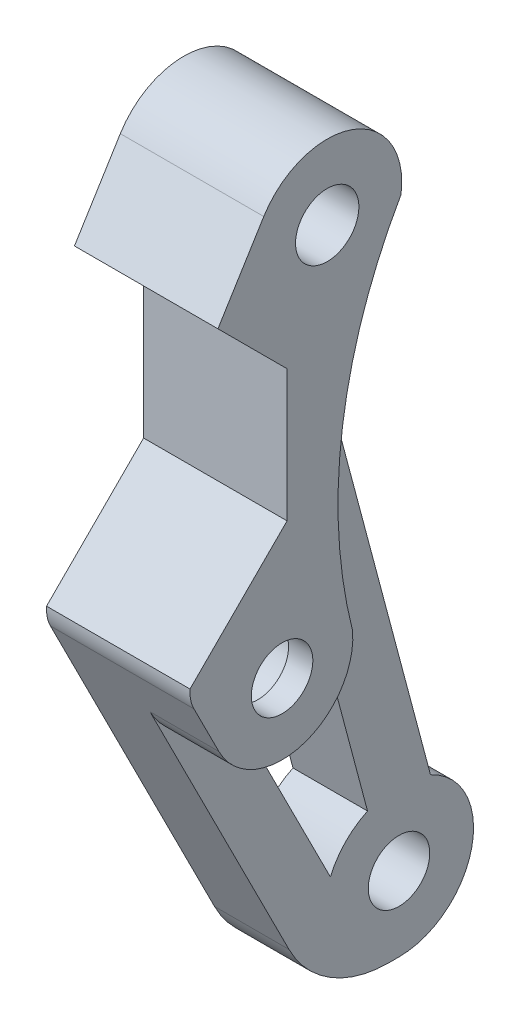
ISO-10303-21;
HEADER;
FILE_DESCRIPTION(('STEP AP214'),'2;1');
FILE_NAME('part.step','',(''),(''),'','','');
FILE_SCHEMA(('AUTOMOTIVE_DESIGN { 1 0 10303 214 1 1 1 1 }'));
ENDSEC;
DATA;
#1=APPLICATION_CONTEXT('core data for automotive mechanical design processes');
#2=APPLICATION_PROTOCOL_DEFINITION('international standard','automotive_design',2000,#1);
#3=PRODUCT_CONTEXT('',#1,'mechanical');
#4=PRODUCT('Part','Part','',(#3));
#5=PRODUCT_RELATED_PRODUCT_CATEGORY('part','',(#4));
#6=PRODUCT_DEFINITION_FORMATION('','',#4);
#7=PRODUCT_DEFINITION_CONTEXT('part definition',#1,'design');
#8=PRODUCT_DEFINITION('design','',#6,#7);
#9=PRODUCT_DEFINITION_SHAPE('','',#8);
#10=(LENGTH_UNIT() NAMED_UNIT(*) SI_UNIT(.MILLI.,.METRE.));
#11=(NAMED_UNIT(*) PLANE_ANGLE_UNIT() SI_UNIT($,.RADIAN.));
#12=(NAMED_UNIT(*) SI_UNIT($,.STERADIAN.) SOLID_ANGLE_UNIT());
#13=UNCERTAINTY_MEASURE_WITH_UNIT(LENGTH_MEASURE(1.E-05),#10,'distance_accuracy_value','');
#14=(GEOMETRIC_REPRESENTATION_CONTEXT(3) GLOBAL_UNCERTAINTY_ASSIGNED_CONTEXT((#13)) GLOBAL_UNIT_ASSIGNED_CONTEXT((#10,
#11,#12)) REPRESENTATION_CONTEXT('',''));
#15=CARTESIAN_POINT('',(0.,0.,0.));
#16=DIRECTION('',(0.,0.,1.));
#17=DIRECTION('',(1.,0.,0.));
#18=AXIS2_PLACEMENT_3D('',#15,#16,#17);
#19=CARTESIAN_POINT('',(7.7,0.,0.));
#20=DIRECTION('',(-1.,0.,0.));
#21=DIRECTION('',(0.,0.,1.));
#22=AXIS2_PLACEMENT_3D('',#19,#20,#21);
#23=PLANE('',#22);
#24=CARTESIAN_POINT('',(7.7,35.6438034109994,7.55308272610218));
#25=DIRECTION('',(-1.,0.,0.));
#26=DIRECTION('',(0.,0.,1.));
#27=AXIS2_PLACEMENT_3D('',#24,#25,#26);
#28=CIRCLE('',#27,1.7);
#29=CARTESIAN_POINT('',(7.7,35.6438034109994,9.25308272610218));
#30=VERTEX_POINT('',#29);
#31=EDGE_CURVE('E226',#30,#30,#28,.F.);
#32=ORIENTED_EDGE('',*,*,#31,.F.);
#33=EDGE_LOOP('',(#32));
#34=FACE_BOUND('',#33,.T.);
#35=CARTESIAN_POINT('',(7.7,15.7921957632189,9.97602858641019));
#36=DIRECTION('',(-1.,0.,0.));
#37=DIRECTION('',(0.,0.,1.));
#38=AXIS2_PLACEMENT_3D('',#35,#36,#37);
#39=CIRCLE('',#38,3.79758016363584);
#40=CARTESIAN_POINT('',(7.7,14.0804677214004,13.3659551652748));
#41=VERTEX_POINT('',#40);
#42=CARTESIAN_POINT('',(7.7,16.1061997343442,6.19145244034602));
#43=VERTEX_POINT('',#42);
#44=EDGE_CURVE('E231',#41,#43,#39,.F.);
#45=ORIENTED_EDGE('',*,*,#44,.T.);
#46=CARTESIAN_POINT('',(7.7,22.3796583886342,-18.5641875375977));
#47=DIRECTION('',(-1.,0.,0.));
#48=DIRECTION('',(0.,0.,1.));
#49=AXIS2_PLACEMENT_3D('',#46,#47,#48);
#50=CIRCLE('',#49,25.5381674010617);
#51=CARTESIAN_POINT('',(7.7,35.0777791166732,3.59333317616438));
#52=VERTEX_POINT('',#51);
#53=EDGE_CURVE('E223',#52,#43,#50,.F.);
#54=ORIENTED_EDGE('',*,*,#53,.F.);
#55=CARTESIAN_POINT('',(7.7,35.6438034109994,7.55308272610218));
#56=DIRECTION('',(-1.,0.,0.));
#57=DIRECTION('',(0.,0.,1.));
#58=AXIS2_PLACEMENT_3D('',#55,#56,#57);
#59=CIRCLE('',#58,4.00000000000001);
#60=CARTESIAN_POINT('',(7.7,37.7439659027633,10.9573913942737));
#61=VERTEX_POINT('',#60);
#62=EDGE_CURVE('E229',#61,#52,#59,.T.);
#63=ORIENTED_EDGE('',*,*,#62,.F.);
#64=DIRECTION('',(0.,0.851077167042886,-0.525040622940982));
#65=VECTOR('',#64,1.);
#66=CARTESIAN_POINT('',(7.7,15.3011018850537,24.8026874035418));
#67=LINE('',#66,#65);
#68=CARTESIAN_POINT('',(7.7,33.7544105775254,13.4186001945268));
#69=VERTEX_POINT('',#68);
#70=EDGE_CURVE('E224',#69,#61,#67,.T.);
#71=ORIENTED_EDGE('',*,*,#70,.F.);
#72=DIRECTION('',(0.,0.707106781186548,0.707106781186548));
#73=VECTOR('',#72,1.);
#74=CARTESIAN_POINT('',(7.7,10.1679051914993,-10.1679051914993));
#75=LINE('',#74,#73);
#76=CARTESIAN_POINT('',(7.7,30.0429893561653,9.70717897316674));
#77=VERTEX_POINT('',#76);
#78=EDGE_CURVE('E197',#77,#69,#75,.T.);
#79=ORIENTED_EDGE('',*,*,#78,.F.);
#80=DIRECTION('',(0.,1.,0.));
#81=VECTOR('',#80,1.);
#82=CARTESIAN_POINT('',(7.7,0.,9.70717897316675));
#83=LINE('',#82,#81);
#84=CARTESIAN_POINT('',(7.7,22.9719215442998,9.70717897316674));
#85=VERTEX_POINT('',#84);
#86=EDGE_CURVE('E367',#85,#77,#83,.T.);
#87=ORIENTED_EDGE('',*,*,#86,.F.);
#88=DIRECTION('',(0.,-0.707106781186548,0.707106781186547));
#89=VECTOR('',#88,1.);
#90=CARTESIAN_POINT('',(7.7,16.3395502587333,16.3395502587333));
#91=LINE('',#90,#89);
#92=CARTESIAN_POINT('',(7.7,17.76189961562,14.9172009018465));
#93=VERTEX_POINT('',#92);
#94=EDGE_CURVE('E11',#85,#93,#91,.T.);
#95=ORIENTED_EDGE('',*,*,#94,.T.);
#96=CARTESIAN_POINT('',(7.7,17.6366537905337,12.9211263833732));
#97=DIRECTION('',(-1.,0.,0.));
#98=DIRECTION('',(0.,0.,1.));
#99=AXIS2_PLACEMENT_3D('',#96,#97,#98);
#100=CIRCLE('',#99,2.);
#101=CARTESIAN_POINT('',(7.7,16.7351702309716,14.7064351499005));
#102=VERTEX_POINT('',#101);
#103=EDGE_CURVE('E49',#93,#102,#100,.F.);
#104=ORIENTED_EDGE('',*,*,#103,.T.);
#105=DIRECTION('',(0.,0.892654383263649,0.450741779781057));
#106=VECTOR('',#105,1.);
#107=CARTESIAN_POINT('',(7.7,-2.5171780092854,4.98504927707151));
#108=LINE('',#107,#106);
#109=EDGE_CURVE('E227',#41,#102,#108,.T.);
#110=ORIENTED_EDGE('',*,*,#109,.F.);
#111=EDGE_LOOP('',(#45,#54,#63,#71,#79,#87,#95,#104,#110));
#112=FACE_BOUND('',#111,.T.);
#113=CARTESIAN_POINT('',(7.7,15.7921957632189,9.97602858641019));
#114=DIRECTION('',(-1.,0.,0.));
#115=DIRECTION('',(0.,0.,1.));
#116=AXIS2_PLACEMENT_3D('',#113,#114,#115);
#117=CIRCLE('',#116,1.65);
#118=CARTESIAN_POINT('',(7.7,15.7921957632189,11.6260285864102));
#119=VERTEX_POINT('',#118);
#120=EDGE_CURVE('E44',#119,#119,#117,.F.);
#121=ORIENTED_EDGE('',*,*,#120,.F.);
#122=EDGE_LOOP('',(#121));
#123=FACE_BOUND('',#122,.T.);
#124=ADVANCED_FACE('F41',(#34,#112,#123),#23,.F.);
#125=CARTESIAN_POINT('',(26.4844851065071,-4.,0.));
#126=DIRECTION('',(0.,-1.,0.));
#127=DIRECTION('',(0.,0.,-1.));
#128=AXIS2_PLACEMENT_3D('',#125,#126,#127);
#129=PLANE('',#128);
#130=DIRECTION('',(0.,0.,1.));
#131=VECTOR('',#130,1.);
#132=CARTESIAN_POINT('',(4.,-4.,0.));
#133=LINE('',#132,#131);
#134=CARTESIAN_POINT('',(4.,-4.,0.));
#135=VERTEX_POINT('',#134);
#136=CARTESIAN_POINT('',(4.,-4.,0.544451416548721));
#137=VERTEX_POINT('',#136);
#138=EDGE_CURVE('E410',#135,#137,#133,.T.);
#139=ORIENTED_EDGE('',*,*,#138,.T.);
#140=DIRECTION('',(-1.,0.,0.));
#141=VECTOR('',#140,1.);
#142=CARTESIAN_POINT('',(0.,-4.,0.544451416548721));
#143=LINE('',#142,#141);
#144=CARTESIAN_POINT('',(0.,-4.,0.544451416548721));
#145=VERTEX_POINT('',#144);
#146=EDGE_CURVE('E271',#137,#145,#143,.T.);
#147=ORIENTED_EDGE('',*,*,#146,.T.);
#148=DIRECTION('',(0.,0.,1.));
#149=VECTOR('',#148,1.);
#150=CARTESIAN_POINT('',(0.,-4.,0.));
#151=LINE('',#150,#149);
#152=CARTESIAN_POINT('',(0.,-4.,0.));
#153=VERTEX_POINT('',#152);
#154=EDGE_CURVE('E401',#153,#145,#151,.T.);
#155=ORIENTED_EDGE('',*,*,#154,.F.);
#156=DIRECTION('',(-1.,0.,0.));
#157=VECTOR('',#156,1.);
#158=CARTESIAN_POINT('',(26.4844851065071,-4.,0.));
#159=LINE('',#158,#157);
#160=EDGE_CURVE('E413',#135,#153,#159,.T.);
#161=ORIENTED_EDGE('',*,*,#160,.F.);
#162=EDGE_LOOP('',(#139,#147,#155,#161));
#163=FACE_BOUND('',#162,.T.);
#164=ADVANCED_FACE('F242',(#163),#129,.T.);
#165=CARTESIAN_POINT('',(4.,0.,0.));
#166=DIRECTION('',(-1.,0.,0.));
#167=DIRECTION('',(0.,0.,1.));
#168=AXIS2_PLACEMENT_3D('',#165,#166,#167);
#169=CYLINDRICAL_SURFACE('',#168,4.);
#170=CARTESIAN_POINT('',(4.,0.,0.));
#171=DIRECTION('',(1.,0.,0.));
#172=DIRECTION('',(0.,0.,-1.));
#173=AXIS2_PLACEMENT_3D('',#170,#171,#172);
#174=CIRCLE('',#173,4.);
#175=CARTESIAN_POINT('',(4.,3.62606237375002,-1.68868933249261));
#176=VERTEX_POINT('',#175);
#177=EDGE_CURVE('E315',#135,#176,#174,.T.);
#178=ORIENTED_EDGE('',*,*,#177,.F.);
#179=ORIENTED_EDGE('',*,*,#160,.T.);
#180=CARTESIAN_POINT('',(0.,0.,0.));
#181=DIRECTION('',(1.,0.,0.));
#182=DIRECTION('',(0.,0.,-1.));
#183=AXIS2_PLACEMENT_3D('',#180,#181,#182);
#184=CIRCLE('',#183,4.);
#185=CARTESIAN_POINT('',(0.,3.62606237375002,-1.68868933249261));
#186=VERTEX_POINT('',#185);
#187=EDGE_CURVE('E308',#153,#186,#184,.T.);
#188=ORIENTED_EDGE('',*,*,#187,.T.);
#189=DIRECTION('',(1.,0.,0.));
#190=VECTOR('',#189,1.);
#191=CARTESIAN_POINT('',(-30.4230571040035,3.62606237375002,-1.68868933249261));
#192=LINE('',#191,#190);
#193=EDGE_CURVE('E299',#186,#176,#192,.T.);
#194=ORIENTED_EDGE('',*,*,#193,.T.);
#195=EDGE_LOOP('',(#178,#179,#188,#194));
#196=FACE_BOUND('',#195,.T.);
#197=ADVANCED_FACE('F454',(#196),#169,.T.);
#198=CARTESIAN_POINT('',(0.,3.62606237375002,1.68868933249261));
#199=VERTEX_POINT('',#198);
#200=CARTESIAN_POINT('',(0.,1.56023781306374,3.6831586942034));
#201=VERTEX_POINT('',#200);
#202=EDGE_CURVE('E316',#199,#201,#184,.T.);
#203=ORIENTED_EDGE('',*,*,#202,.T.);
#204=DIRECTION('',(-1.,0.,0.));
#205=VECTOR('',#204,1.);
#206=CARTESIAN_POINT('',(26.4844851065071,1.56023781306374,3.6831586942034));
#207=LINE('',#206,#205);
#208=CARTESIAN_POINT('',(4.,1.56023781306374,3.6831586942034));
#209=VERTEX_POINT('',#208);
#210=EDGE_CURVE('E406',#209,#201,#207,.T.);
#211=ORIENTED_EDGE('',*,*,#210,.F.);
#212=CARTESIAN_POINT('',(4.,3.62606237375002,1.68868933249261));
#213=VERTEX_POINT('',#212);
#214=EDGE_CURVE('E311',#213,#209,#174,.T.);
#215=ORIENTED_EDGE('',*,*,#214,.F.);
#216=DIRECTION('',(1.,0.,0.));
#217=VECTOR('',#216,1.);
#218=CARTESIAN_POINT('',(-30.4230571040035,3.62606237375002,1.68868933249261));
#219=LINE('',#218,#217);
#220=EDGE_CURVE('E298',#199,#213,#219,.T.);
#221=ORIENTED_EDGE('',*,*,#220,.F.);
#222=EDGE_LOOP('',(#203,#211,#215,#221));
#223=FACE_BOUND('',#222,.T.);
#224=ADVANCED_FACE('F422',(#223),#169,.T.);
#225=CARTESIAN_POINT('',(26.4844851065071,12.118374083072,9.01444168876506));
#226=DIRECTION('',(0.,0.450741779781056,-0.892654383263649));
#227=DIRECTION('',(0.,0.892654383263649,0.450741779781056));
#228=AXIS2_PLACEMENT_3D('',#225,#226,#227);
#229=PLANE('',#228);
#230=DIRECTION('',(0.,-0.892654383263649,-0.450741779781056));
#231=VECTOR('',#230,1.);
#232=CARTESIAN_POINT('',(0.,12.118374083072,9.01444168876506));
#233=LINE('',#232,#231);
#234=CARTESIAN_POINT('',(0.,11.6056471528656,8.75554255221689));
#235=VERTEX_POINT('',#234);
#236=EDGE_CURVE('E400',#235,#201,#233,.T.);
#237=ORIENTED_EDGE('',*,*,#236,.F.);
#238=DIRECTION('',(-1.,0.,0.));
#239=VECTOR('',#238,1.);
#240=CARTESIAN_POINT('',(4.,11.6056471528656,8.75554255221689));
#241=LINE('',#240,#239);
#242=CARTESIAN_POINT('',(4.,11.6056471528656,8.75554255221689));
#243=VERTEX_POINT('',#242);
#244=EDGE_CURVE('E321',#235,#243,#241,.F.);
#245=ORIENTED_EDGE('',*,*,#244,.T.);
#246=DIRECTION('',(0.,-0.892654383263649,-0.450741779781056));
#247=VECTOR('',#246,1.);
#248=CARTESIAN_POINT('',(4.,12.118374083072,9.01444168876506));
#249=LINE('',#248,#247);
#250=EDGE_CURVE('E332',#243,#209,#249,.T.);
#251=ORIENTED_EDGE('',*,*,#250,.T.);
#252=ORIENTED_EDGE('',*,*,#210,.T.);
#253=EDGE_LOOP('',(#237,#245,#251,#252));
#254=FACE_BOUND('',#253,.T.);
#255=ADVANCED_FACE('F419',(#254),#229,.T.);
#256=CARTESIAN_POINT('',(-15.4235639409025,18.1405352375146,6.06738803288033));
#257=DIRECTION('',(1.,0.,0.));
#258=DIRECTION('',(0.,0.,-1.));
#259=AXIS2_PLACEMENT_3D('',#256,#257,#258);
#260=CYLINDRICAL_SURFACE('',#259,0.5);
#261=CARTESIAN_POINT('',(4.,18.1405352375146,6.06738803288033));
#262=DIRECTION('',(1.,0.,0.));
#263=DIRECTION('',(0.,0.,-1.));
#264=AXIS2_PLACEMENT_3D('',#261,#262,#263);
#265=CIRCLE('',#264,0.5);
#266=CARTESIAN_POINT('',(4.,18.0554917511465,6.56010256019443));
#267=VERTEX_POINT('',#266);
#268=CARTESIAN_POINT('',(4.,18.2690800368411,5.58419424715238));
#269=VERTEX_POINT('',#268);
#270=EDGE_CURVE('E189',#267,#269,#265,.F.);
#271=ORIENTED_EDGE('',*,*,#270,.F.);
#272=DIRECTION('',(1.,0.,0.));
#273=VECTOR('',#272,1.);
#274=CARTESIAN_POINT('',(-15.4235639409025,18.0554917511465,6.56010256019444));
#275=LINE('',#274,#273);
#276=CARTESIAN_POINT('',(0.,18.0554917511465,6.56010256019443));
#277=VERTEX_POINT('',#276);
#278=EDGE_CURVE('E201',#277,#267,#275,.T.);
#279=ORIENTED_EDGE('',*,*,#278,.F.);
#280=CARTESIAN_POINT('',(0.,18.1405352375146,6.06738803288033));
#281=DIRECTION('',(1.,0.,0.));
#282=DIRECTION('',(0.,0.,-1.));
#283=AXIS2_PLACEMENT_3D('',#280,#281,#282);
#284=CIRCLE('',#283,0.5);
#285=CARTESIAN_POINT('',(0.,18.2690800368411,5.58419424715238));
#286=VERTEX_POINT('',#285);
#287=EDGE_CURVE('E211',#286,#277,#284,.T.);
#288=ORIENTED_EDGE('',*,*,#287,.F.);
#289=DIRECTION('',(-1.,0.,0.));
#290=VECTOR('',#289,1.);
#291=CARTESIAN_POINT('',(0.,18.2690800368411,5.58419424715238));
#292=LINE('',#291,#290);
#293=EDGE_CURVE('E206',#269,#286,#292,.T.);
#294=ORIENTED_EDGE('',*,*,#293,.F.);
#295=EDGE_LOOP('',(#271,#279,#288,#294));
#296=FACE_BOUND('',#295,.T.);
#297=ADVANCED_FACE('F208',(#296),#260,.F.);
#298=CARTESIAN_POINT('',(-30.4230571040035,-0.179886996558466,0.676186662748976));
#299=DIRECTION('',(0.,0.257089598652981,-0.966387571455909));
#300=DIRECTION('',(0.,0.966387571455909,0.257089598652981));
#301=AXIS2_PLACEMENT_3D('',#298,#299,#300);
#302=PLANE('',#301);
#303=DIRECTION('',(0.,0.966387571455909,0.257089598652981));
#304=VECTOR('',#303,1.);
#305=CARTESIAN_POINT('',(4.,-0.179886996558466,0.676186662748976));
#306=LINE('',#305,#304);
#307=EDGE_CURVE('E287',#213,#269,#306,.T.);
#308=ORIENTED_EDGE('',*,*,#307,.T.);
#309=ORIENTED_EDGE('',*,*,#293,.T.);
#310=DIRECTION('',(0.,-0.966387571455909,-0.257089598652981));
#311=VECTOR('',#310,1.);
#312=CARTESIAN_POINT('',(0.,-0.179886996558466,0.676186662748976));
#313=LINE('',#312,#311);
#314=EDGE_CURVE('E293',#286,#199,#313,.T.);
#315=ORIENTED_EDGE('',*,*,#314,.T.);
#316=ORIENTED_EDGE('',*,*,#220,.T.);
#317=EDGE_LOOP('',(#308,#309,#315,#316));
#318=FACE_BOUND('',#317,.T.);
#319=ADVANCED_FACE('F426',(#318),#302,.F.);
#320=CARTESIAN_POINT('',(4.,35.6438034109994,7.55308272610218));
#321=DIRECTION('',(-1.,0.,0.));
#322=DIRECTION('',(0.,0.,1.));
#323=AXIS2_PLACEMENT_3D('',#320,#321,#322);
#324=CYLINDRICAL_SURFACE('',#323,1.65);
#325=CARTESIAN_POINT('',(4.,35.6438034109994,7.55308272610218));
#326=DIRECTION('',(1.,0.,0.));
#327=DIRECTION('',(0.,0.,-1.));
#328=AXIS2_PLACEMENT_3D('',#325,#326,#327);
#329=CIRCLE('',#328,1.65);
#330=CARTESIAN_POINT('',(4.,35.6438034109994,5.90308272610218));
#331=VERTEX_POINT('',#330);
#332=EDGE_CURVE('E283',#331,#331,#329,.T.);
#333=ORIENTED_EDGE('',*,*,#332,.T.);
#334=EDGE_LOOP('',(#333));
#335=FACE_BOUND('',#334,.T.);
#336=CARTESIAN_POINT('',(0.,35.6438034109994,7.55308272610218));
#337=DIRECTION('',(1.,0.,0.));
#338=DIRECTION('',(0.,0.,-1.));
#339=AXIS2_PLACEMENT_3D('',#336,#337,#338);
#340=CIRCLE('',#339,1.65);
#341=CARTESIAN_POINT('',(0.,35.6438034109994,5.90308272610218));
#342=VERTEX_POINT('',#341);
#343=EDGE_CURVE('E284',#342,#342,#340,.T.);
#344=ORIENTED_EDGE('',*,*,#343,.F.);
#345=EDGE_LOOP('',(#344));
#346=FACE_BOUND('',#345,.T.);
#347=ADVANCED_FACE('F428',(#335,#346),#324,.F.);
#348=CARTESIAN_POINT('',(4.,0.,0.));
#349=DIRECTION('',(-1.,0.,0.));
#350=DIRECTION('',(0.,0.,1.));
#351=AXIS2_PLACEMENT_3D('',#348,#349,#350);
#352=CYLINDRICAL_SURFACE('',#351,1.65);
#353=CARTESIAN_POINT('',(4.,0.,0.));
#354=DIRECTION('',(1.,0.,0.));
#355=DIRECTION('',(0.,0.,-1.));
#356=AXIS2_PLACEMENT_3D('',#353,#354,#355);
#357=CIRCLE('',#356,1.65);
#358=CARTESIAN_POINT('',(4.,0.,-1.65));
#359=VERTEX_POINT('',#358);
#360=EDGE_CURVE('E305',#359,#359,#357,.T.);
#361=ORIENTED_EDGE('',*,*,#360,.T.);
#362=EDGE_LOOP('',(#361));
#363=FACE_BOUND('',#362,.T.);
#364=CARTESIAN_POINT('',(0.,0.,0.));
#365=DIRECTION('',(1.,0.,0.));
#366=DIRECTION('',(0.,0.,-1.));
#367=AXIS2_PLACEMENT_3D('',#364,#365,#366);
#368=CIRCLE('',#367,1.65);
#369=CARTESIAN_POINT('',(0.,0.,-1.65));
#370=VERTEX_POINT('',#369);
#371=EDGE_CURVE('E292',#370,#370,#368,.T.);
#372=ORIENTED_EDGE('',*,*,#371,.F.);
#373=EDGE_LOOP('',(#372));
#374=FACE_BOUND('',#373,.T.);
#375=ADVANCED_FACE('F434',(#363,#374),#352,.F.);
#376=CARTESIAN_POINT('',(6.4,15.7921957632189,9.97602858641019));
#377=DIRECTION('',(-1.,0.,0.));
#378=DIRECTION('',(0.,0.,1.));
#379=AXIS2_PLACEMENT_3D('',#376,#377,#378);
#380=CYLINDRICAL_SURFACE('',#379,2.25);
#381=CARTESIAN_POINT('',(6.4,15.7921957632189,9.97602858641019));
#382=DIRECTION('',(-1.,0.,0.));
#383=DIRECTION('',(0.,0.,1.));
#384=AXIS2_PLACEMENT_3D('',#381,#382,#383);
#385=CIRCLE('',#384,2.25);
#386=CARTESIAN_POINT('',(6.4,15.7921957632189,12.2260285864102));
#387=VERTEX_POINT('',#386);
#388=EDGE_CURVE('E260',#387,#387,#385,.T.);
#389=ORIENTED_EDGE('',*,*,#388,.F.);
#390=EDGE_LOOP('',(#389));
#391=FACE_BOUND('',#390,.T.);
#392=CARTESIAN_POINT('',(0.,15.7921957632189,9.97602858641019));
#393=DIRECTION('',(-1.,0.,0.));
#394=DIRECTION('',(0.,0.,1.));
#395=AXIS2_PLACEMENT_3D('',#392,#393,#394);
#396=CIRCLE('',#395,2.25);
#397=CARTESIAN_POINT('',(0.,15.7921957632189,12.2260285864102));
#398=VERTEX_POINT('',#397);
#399=EDGE_CURVE('E266',#398,#398,#396,.T.);
#400=ORIENTED_EDGE('',*,*,#399,.T.);
#401=EDGE_LOOP('',(#400));
#402=FACE_BOUND('',#401,.T.);
#403=ADVANCED_FACE('F443',(#391,#402),#380,.F.);
#404=CARTESIAN_POINT('',(26.4844851065071,2.,0.544451416548721));
#405=DIRECTION('',(1.,0.,0.));
#406=DIRECTION('',(0.,0.,-1.));
#407=AXIS2_PLACEMENT_3D('',#404,#405,#406);
#408=CYLINDRICAL_SURFACE('',#407,6.);
#409=CARTESIAN_POINT('',(4.,2.,0.544451416548721));
#410=DIRECTION('',(1.,0.,0.));
#411=DIRECTION('',(0.,0.,-1.));
#412=AXIS2_PLACEMENT_3D('',#409,#410,#411);
#413=CIRCLE('',#412,6.);
#414=CARTESIAN_POINT('',(4.,-0.704450678686354,5.90037771613063));
#415=VERTEX_POINT('',#414);
#416=EDGE_CURVE('E279',#415,#137,#413,.T.);
#417=ORIENTED_EDGE('',*,*,#416,.F.);
#418=DIRECTION('',(-1.,0.,0.));
#419=VECTOR('',#418,1.);
#420=CARTESIAN_POINT('',(4.,-0.704450678686342,5.90037771613061));
#421=LINE('',#420,#419);
#422=CARTESIAN_POINT('',(0.,-0.704450678686342,5.90037771613061));
#423=VERTEX_POINT('',#422);
#424=EDGE_CURVE('E277',#423,#415,#421,.F.);
#425=ORIENTED_EDGE('',*,*,#424,.F.);
#426=CARTESIAN_POINT('',(0.,2.,0.544451416548721));
#427=DIRECTION('',(1.,0.,0.));
#428=DIRECTION('',(0.,0.,-1.));
#429=AXIS2_PLACEMENT_3D('',#426,#427,#428);
#430=CIRCLE('',#429,6.);
#431=EDGE_CURVE('E274',#145,#423,#430,.F.);
#432=ORIENTED_EDGE('',*,*,#431,.F.);
#433=ORIENTED_EDGE('',*,*,#146,.F.);
#434=EDGE_LOOP('',(#417,#425,#432,#433));
#435=FACE_BOUND('',#434,.T.);
#436=ADVANCED_FACE('F469',(#435),#408,.T.);
#437=CARTESIAN_POINT('',(-15.4235639409025,22.3919133800727,-18.5637255467815));
#438=DIRECTION('',(1.,0.,0.));
#439=DIRECTION('',(0.,0.,-1.));
#440=AXIS2_PLACEMENT_3D('',#437,#438,#439);
#441=CYLINDRICAL_SURFACE('',#440,25.4953190074706);
#442=CARTESIAN_POINT('',(4.,22.3919133800727,-18.5637255467815));
#443=DIRECTION('',(1.,0.,0.));
#444=DIRECTION('',(0.,0.,-1.));
#445=AXIS2_PLACEMENT_3D('',#442,#443,#444);
#446=CIRCLE('',#445,25.4953190074706);
#447=CARTESIAN_POINT('',(4.,16.6511192090167,6.2768576504437));
#448=VERTEX_POINT('',#447);
#449=EDGE_CURVE('E184',#448,#267,#446,.F.);
#450=ORIENTED_EDGE('',*,*,#449,.F.);
#451=DIRECTION('',(1.,0.,0.));
#452=VECTOR('',#451,1.);
#453=CARTESIAN_POINT('',(-15.4235639409025,16.6511192090167,6.27685765044361));
#454=LINE('',#453,#452);
#455=CARTESIAN_POINT('',(0.,16.6511192090167,6.27685765044361));
#456=VERTEX_POINT('',#455);
#457=EDGE_CURVE('E347',#456,#448,#454,.T.);
#458=ORIENTED_EDGE('',*,*,#457,.F.);
#459=CARTESIAN_POINT('',(0.,22.3919133800727,-18.5637255467815));
#460=DIRECTION('',(1.,0.,0.));
#461=DIRECTION('',(0.,0.,-1.));
#462=AXIS2_PLACEMENT_3D('',#459,#460,#461);
#463=CIRCLE('',#462,25.4953190074706);
#464=EDGE_CURVE('E203',#456,#277,#463,.F.);
#465=ORIENTED_EDGE('',*,*,#464,.T.);
#466=ORIENTED_EDGE('',*,*,#278,.T.);
#467=EDGE_LOOP('',(#450,#458,#465,#466));
#468=FACE_BOUND('',#467,.T.);
#469=ADVANCED_FACE('F202',(#468),#441,.F.);
#470=CARTESIAN_POINT('',(-15.4235639409025,11.8310180427561,8.30921536058507));
#471=DIRECTION('',(1.,0.,0.));
#472=DIRECTION('',(0.,0.,-1.));
#473=AXIS2_PLACEMENT_3D('',#470,#471,#472);
#474=CYLINDRICAL_SURFACE('',#473,0.5);
#475=CARTESIAN_POINT('',(4.,11.8310180427561,8.30921536058507));
#476=DIRECTION('',(1.,0.,0.));
#477=DIRECTION('',(0.,0.,-1.));
#478=AXIS2_PLACEMENT_3D('',#475,#476,#477);
#479=CIRCLE('',#478,0.5);
#480=CARTESIAN_POINT('',(4.,12.2918794542523,8.50313998355417));
#481=VERTEX_POINT('',#480);
#482=EDGE_CURVE('E216',#243,#481,#479,.F.);
#483=ORIENTED_EDGE('',*,*,#482,.F.);
#484=ORIENTED_EDGE('',*,*,#244,.F.);
#485=CARTESIAN_POINT('',(0.,11.8310180427561,8.30921536058507));
#486=DIRECTION('',(1.,0.,0.));
#487=DIRECTION('',(0.,0.,-1.));
#488=AXIS2_PLACEMENT_3D('',#485,#486,#487);
#489=CIRCLE('',#488,0.5);
#490=CARTESIAN_POINT('',(0.,12.2918794542523,8.50313998355417));
#491=VERTEX_POINT('',#490);
#492=EDGE_CURVE('E205',#491,#235,#489,.T.);
#493=ORIENTED_EDGE('',*,*,#492,.F.);
#494=DIRECTION('',(1.,0.,0.));
#495=VECTOR('',#494,1.);
#496=CARTESIAN_POINT('',(-15.4235639409025,12.2918794542523,8.50313998355417));
#497=LINE('',#496,#495);
#498=EDGE_CURVE('E314',#481,#491,#497,.F.);
#499=ORIENTED_EDGE('',*,*,#498,.F.);
#500=EDGE_LOOP('',(#483,#484,#493,#499));
#501=FACE_BOUND('',#500,.T.);
#502=ADVANCED_FACE('F335',(#501),#474,.F.);
#503=CARTESIAN_POINT('',(-15.4235639409025,-2.5171780092854,4.98504927707151));
#504=DIRECTION('',(0.,0.450741779781057,-0.892654383263649));
#505=DIRECTION('',(0.,0.892654383263649,0.450741779781057));
#506=AXIS2_PLACEMENT_3D('',#503,#504,#505);
#507=PLANE('',#506);
#508=DIRECTION('',(1.,0.,0.));
#509=VECTOR('',#508,1.);
#510=CARTESIAN_POINT('',(-15.4235639409025,14.0804677214004,13.3659551652748));
#511=LINE('',#510,#509);
#512=CARTESIAN_POINT('',(4.,14.0804677214004,13.3659551652748));
#513=VERTEX_POINT('',#512);
#514=EDGE_CURVE('E263',#513,#41,#511,.T.);
#515=ORIENTED_EDGE('',*,*,#514,.T.);
#516=ORIENTED_EDGE('',*,*,#109,.T.);
#517=DIRECTION('',(1.,0.,0.));
#518=VECTOR('',#517,1.);
#519=CARTESIAN_POINT('',(0.,16.7351702309716,14.7064351499005));
#520=LINE('',#519,#518);
#521=CARTESIAN_POINT('',(0.,16.7351702309716,14.7064351499005));
#522=VERTEX_POINT('',#521);
#523=EDGE_CURVE('E346',#102,#522,#520,.F.);
#524=ORIENTED_EDGE('',*,*,#523,.T.);
#525=DIRECTION('',(0.,-0.892654383263649,-0.450741779781057));
#526=VECTOR('',#525,1.);
#527=CARTESIAN_POINT('',(0.,-2.5171780092854,4.98504927707151));
#528=LINE('',#527,#526);
#529=EDGE_CURVE('E259',#522,#423,#528,.T.);
#530=ORIENTED_EDGE('',*,*,#529,.T.);
#531=ORIENTED_EDGE('',*,*,#424,.T.);
#532=DIRECTION('',(0.,0.892654383263649,0.450741779781056));
#533=VECTOR('',#532,1.);
#534=CARTESIAN_POINT('',(4.,14.0804677214004,13.3659551652748));
#535=LINE('',#534,#533);
#536=EDGE_CURVE('E408',#415,#513,#535,.T.);
#537=ORIENTED_EDGE('',*,*,#536,.T.);
#538=EDGE_LOOP('',(#515,#516,#524,#530,#531,#537));
#539=FACE_BOUND('',#538,.T.);
#540=ADVANCED_FACE('F459',(#539),#507,.F.);
#541=CARTESIAN_POINT('',(-18.8681269811982,15.3011018850537,24.8026874035418));
#542=DIRECTION('',(0.,-0.525040622940982,-0.851077167042886));
#543=DIRECTION('',(0.,0.851077167042886,-0.525040622940982));
#544=AXIS2_PLACEMENT_3D('',#541,#542,#543);
#545=PLANE('',#544);
#546=DIRECTION('',(1.,0.,0.));
#547=VECTOR('',#546,1.);
#548=CARTESIAN_POINT('',(-18.8681269811982,33.7544105775254,13.4186001945269));
#549=LINE('',#548,#547);
#550=CARTESIAN_POINT('',(0.,33.7544105775254,13.4186001945268));
#551=VERTEX_POINT('',#550);
#552=EDGE_CURVE('E210',#551,#69,#549,.T.);
#553=ORIENTED_EDGE('',*,*,#552,.T.);
#554=ORIENTED_EDGE('',*,*,#70,.T.);
#555=DIRECTION('',(1.,0.,0.));
#556=VECTOR('',#555,1.);
#557=CARTESIAN_POINT('',(-18.8681269811982,37.7439659027633,10.9573913942737));
#558=LINE('',#557,#556);
#559=CARTESIAN_POINT('',(0.,37.7439659027633,10.9573913942737));
#560=VERTEX_POINT('',#559);
#561=EDGE_CURVE('E385',#560,#61,#558,.T.);
#562=ORIENTED_EDGE('',*,*,#561,.F.);
#563=DIRECTION('',(0.,-0.851077167042886,0.525040622940982));
#564=VECTOR('',#563,1.);
#565=CARTESIAN_POINT('',(0.,15.3011018850537,24.8026874035418));
#566=LINE('',#565,#564);
#567=EDGE_CURVE('E384',#560,#551,#566,.T.);
#568=ORIENTED_EDGE('',*,*,#567,.T.);
#569=EDGE_LOOP('',(#553,#554,#562,#568));
#570=FACE_BOUND('',#569,.T.);
#571=ADVANCED_FACE('F466',(#570),#545,.F.);
#572=CARTESIAN_POINT('',(0.,17.6366537905337,12.9211263833732));
#573=DIRECTION('',(-1.,0.,0.));
#574=DIRECTION('',(0.,0.,1.));
#575=AXIS2_PLACEMENT_3D('',#572,#573,#574);
#576=CYLINDRICAL_SURFACE('',#575,2.);
#577=ORIENTED_EDGE('',*,*,#103,.F.);
#578=DIRECTION('',(-1.,0.,0.));
#579=VECTOR('',#578,1.);
#580=CARTESIAN_POINT('',(0.,17.76189961562,14.9172009018465));
#581=LINE('',#580,#579);
#582=CARTESIAN_POINT('',(0.,17.76189961562,14.9172009018465));
#583=VERTEX_POINT('',#582);
#584=EDGE_CURVE('E214',#93,#583,#581,.T.);
#585=ORIENTED_EDGE('',*,*,#584,.T.);
#586=CARTESIAN_POINT('',(0.,17.6366537905337,12.9211263833732));
#587=DIRECTION('',(1.,0.,0.));
#588=DIRECTION('',(0.,0.,-1.));
#589=AXIS2_PLACEMENT_3D('',#586,#587,#588);
#590=CIRCLE('',#589,2.);
#591=EDGE_CURVE('E275',#522,#583,#590,.F.);
#592=ORIENTED_EDGE('',*,*,#591,.F.);
#593=ORIENTED_EDGE('',*,*,#523,.F.);
#594=EDGE_LOOP('',(#577,#585,#592,#593));
#595=FACE_BOUND('',#594,.T.);
#596=ADVANCED_FACE('F361',(#595),#576,.T.);
#597=CARTESIAN_POINT('',(0.,16.3395502587333,16.3395502587333));
#598=DIRECTION('',(0.,0.707106781186548,0.707106781186548));
#599=DIRECTION('',(0.,-0.707106781186548,0.707106781186547));
#600=AXIS2_PLACEMENT_3D('',#597,#598,#599);
#601=PLANE('',#600);
#602=ORIENTED_EDGE('',*,*,#94,.F.);
#603=DIRECTION('',(1.,0.,0.));
#604=VECTOR('',#603,1.);
#605=CARTESIAN_POINT('',(0.,22.9719215442998,9.70717897316674));
#606=LINE('',#605,#604);
#607=CARTESIAN_POINT('',(0.,22.9719215442998,9.70717897316674));
#608=VERTEX_POINT('',#607);
#609=EDGE_CURVE('E364',#608,#85,#606,.T.);
#610=ORIENTED_EDGE('',*,*,#609,.F.);
#611=DIRECTION('',(0.,-0.707106781186548,0.707106781186547));
#612=VECTOR('',#611,1.);
#613=CARTESIAN_POINT('',(0.,16.3395502587333,16.3395502587333));
#614=LINE('',#613,#612);
#615=EDGE_CURVE('E360',#608,#583,#614,.T.);
#616=ORIENTED_EDGE('',*,*,#615,.T.);
#617=ORIENTED_EDGE('',*,*,#584,.F.);
#618=EDGE_LOOP('',(#602,#610,#616,#617));
#619=FACE_BOUND('',#618,.T.);
#620=ADVANCED_FACE('F362',(#619),#601,.T.);
#621=CARTESIAN_POINT('',(0.,0.,0.));
#622=DIRECTION('',(1.,0.,0.));
#623=DIRECTION('',(0.,0.,-1.));
#624=AXIS2_PLACEMENT_3D('',#621,#622,#623);
#625=PLANE('',#624);
#626=ORIENTED_EDGE('',*,*,#399,.F.);
#627=EDGE_LOOP('',(#626));
#628=FACE_BOUND('',#627,.T.);
#629=ORIENTED_EDGE('',*,*,#371,.T.);
#630=EDGE_LOOP('',(#629));
#631=FACE_BOUND('',#630,.T.);
#632=ORIENTED_EDGE('',*,*,#343,.T.);
#633=EDGE_LOOP('',(#632));
#634=FACE_BOUND('',#633,.T.);
#635=ORIENTED_EDGE('',*,*,#314,.F.);
#636=ORIENTED_EDGE('',*,*,#287,.T.);
#637=ORIENTED_EDGE('',*,*,#464,.F.);
#638=CARTESIAN_POINT('',(0.,15.7921957632189,9.97602858641019));
#639=DIRECTION('',(1.,0.,0.));
#640=DIRECTION('',(0.,0.,-1.));
#641=AXIS2_PLACEMENT_3D('',#638,#639,#640);
#642=CIRCLE('',#641,3.79758016363584);
#643=EDGE_CURVE('E340',#456,#491,#642,.F.);
#644=ORIENTED_EDGE('',*,*,#643,.T.);
#645=ORIENTED_EDGE('',*,*,#492,.T.);
#646=ORIENTED_EDGE('',*,*,#236,.T.);
#647=ORIENTED_EDGE('',*,*,#202,.F.);
#648=EDGE_LOOP('',(#635,#636,#637,#644,#645,#646,#647));
#649=FACE_BOUND('',#648,.T.);
#650=ORIENTED_EDGE('',*,*,#615,.F.);
#651=DIRECTION('',(0.,1.,0.));
#652=VECTOR('',#651,1.);
#653=CARTESIAN_POINT('',(0.,0.,9.70717897316675));
#654=LINE('',#653,#652);
#655=CARTESIAN_POINT('',(0.,30.0429893561653,9.70717897316674));
#656=VERTEX_POINT('',#655);
#657=EDGE_CURVE('E370',#608,#656,#654,.T.);
#658=ORIENTED_EDGE('',*,*,#657,.T.);
#659=DIRECTION('',(0.,0.707106781186548,0.707106781186548));
#660=VECTOR('',#659,1.);
#661=CARTESIAN_POINT('',(0.,10.1679051914993,-10.1679051914993));
#662=LINE('',#661,#660);
#663=EDGE_CURVE('E366',#656,#551,#662,.T.);
#664=ORIENTED_EDGE('',*,*,#663,.T.);
#665=ORIENTED_EDGE('',*,*,#567,.F.);
#666=CARTESIAN_POINT('',(0.,35.6438034109994,7.55308272610218));
#667=DIRECTION('',(1.,0.,0.));
#668=DIRECTION('',(0.,0.,-1.));
#669=AXIS2_PLACEMENT_3D('',#666,#667,#668);
#670=CIRCLE('',#669,4.00000000000001);
#671=CARTESIAN_POINT('',(0.,35.0777791166732,3.59333317616438));
#672=VERTEX_POINT('',#671);
#673=EDGE_CURVE('E281',#672,#560,#670,.T.);
#674=ORIENTED_EDGE('',*,*,#673,.F.);
#675=CARTESIAN_POINT('',(0.,22.3796583886342,-18.5641875375977));
#676=DIRECTION('',(1.,0.,0.));
#677=DIRECTION('',(0.,0.,-1.));
#678=AXIS2_PLACEMENT_3D('',#675,#676,#677);
#679=CIRCLE('',#678,25.5381674010617);
#680=CARTESIAN_POINT('',(0.,30.808861671324,5.54279332321815));
#681=VERTEX_POINT('',#680);
#682=EDGE_CURVE('E382',#681,#672,#679,.F.);
#683=ORIENTED_EDGE('',*,*,#682,.F.);
#684=DIRECTION('',(0.,-0.966387571455909,-0.257089598652981));
#685=VECTOR('',#684,1.);
#686=CARTESIAN_POINT('',(0.,0.659216629458398,-2.47796395086972));
#687=LINE('',#686,#685);
#688=EDGE_CURVE('E290',#681,#186,#687,.T.);
#689=ORIENTED_EDGE('',*,*,#688,.T.);
#690=ORIENTED_EDGE('',*,*,#187,.F.);
#691=ORIENTED_EDGE('',*,*,#154,.T.);
#692=ORIENTED_EDGE('',*,*,#431,.T.);
#693=ORIENTED_EDGE('',*,*,#529,.F.);
#694=ORIENTED_EDGE('',*,*,#591,.T.);
#695=EDGE_LOOP('',(#650,#658,#664,#665,#674,#683,#689,#690,#691,#692,#693,#694));
#696=FACE_BOUND('',#695,.T.);
#697=ADVANCED_FACE('F343',(#628,#631,#634,#649,#696),#625,.F.);
#698=CARTESIAN_POINT('',(0.,10.1679051914993,-10.1679051914993));
#699=DIRECTION('',(0.,0.707106781186548,-0.707106781186548));
#700=DIRECTION('',(0.,0.707106781186548,0.707106781186548));
#701=AXIS2_PLACEMENT_3D('',#698,#699,#700);
#702=PLANE('',#701);
#703=ORIENTED_EDGE('',*,*,#663,.F.);
#704=DIRECTION('',(1.,0.,0.));
#705=VECTOR('',#704,1.);
#706=CARTESIAN_POINT('',(0.,30.0429893561653,9.70717897316674));
#707=LINE('',#706,#705);
#708=EDGE_CURVE('E378',#656,#77,#707,.T.);
#709=ORIENTED_EDGE('',*,*,#708,.T.);
#710=ORIENTED_EDGE('',*,*,#78,.T.);
#711=ORIENTED_EDGE('',*,*,#552,.F.);
#712=EDGE_LOOP('',(#703,#709,#710,#711));
#713=FACE_BOUND('',#712,.T.);
#714=ADVANCED_FACE('F452',(#713),#702,.F.);
#715=CARTESIAN_POINT('',(0.,0.,9.70717897316675));
#716=DIRECTION('',(0.,0.,-1.));
#717=DIRECTION('',(0.,1.,0.));
#718=AXIS2_PLACEMENT_3D('',#715,#716,#717);
#719=PLANE('',#718);
#720=ORIENTED_EDGE('',*,*,#86,.T.);
#721=ORIENTED_EDGE('',*,*,#708,.F.);
#722=ORIENTED_EDGE('',*,*,#657,.F.);
#723=ORIENTED_EDGE('',*,*,#609,.T.);
#724=EDGE_LOOP('',(#720,#721,#722,#723));
#725=FACE_BOUND('',#724,.T.);
#726=ADVANCED_FACE('F503',(#725),#719,.F.);
#727=CARTESIAN_POINT('',(-30.4230571040035,0.659216629458398,-2.47796395086972));
#728=DIRECTION('',(0.,0.257089598652981,-0.966387571455909));
#729=DIRECTION('',(0.,0.966387571455909,0.257089598652981));
#730=AXIS2_PLACEMENT_3D('',#727,#728,#729);
#731=PLANE('',#730);
#732=ORIENTED_EDGE('',*,*,#688,.F.);
#733=DIRECTION('',(1.,0.,0.));
#734=VECTOR('',#733,1.);
#735=CARTESIAN_POINT('',(-18.8681269811982,30.808861671324,5.54279332321814));
#736=LINE('',#735,#734);
#737=CARTESIAN_POINT('',(4.,30.808861671324,5.54279332321814));
#738=VERTEX_POINT('',#737);
#739=EDGE_CURVE('E388',#681,#738,#736,.T.);
#740=ORIENTED_EDGE('',*,*,#739,.T.);
#741=DIRECTION('',(0.,0.966387571455909,0.257089598652981));
#742=VECTOR('',#741,1.);
#743=CARTESIAN_POINT('',(4.,0.659216629458398,-2.47796395086972));
#744=LINE('',#743,#742);
#745=EDGE_CURVE('E295',#176,#738,#744,.T.);
#746=ORIENTED_EDGE('',*,*,#745,.F.);
#747=ORIENTED_EDGE('',*,*,#193,.F.);
#748=EDGE_LOOP('',(#732,#740,#746,#747));
#749=FACE_BOUND('',#748,.T.);
#750=ADVANCED_FACE('F440',(#749),#731,.T.);
#751=CARTESIAN_POINT('',(4.,0.,0.));
#752=DIRECTION('',(1.,0.,0.));
#753=DIRECTION('',(0.,0.,-1.));
#754=AXIS2_PLACEMENT_3D('',#751,#752,#753);
#755=PLANE('',#754);
#756=ORIENTED_EDGE('',*,*,#177,.T.);
#757=ORIENTED_EDGE('',*,*,#745,.T.);
#758=CARTESIAN_POINT('',(4.,22.3796583886342,-18.5641875375977));
#759=DIRECTION('',(1.,0.,0.));
#760=DIRECTION('',(0.,0.,-1.));
#761=AXIS2_PLACEMENT_3D('',#758,#759,#760);
#762=CIRCLE('',#761,25.5381674010617);
#763=CARTESIAN_POINT('',(4.,16.1061997343441,6.191452440346));
#764=VERTEX_POINT('',#763);
#765=EDGE_CURVE('E393',#738,#764,#762,.T.);
#766=ORIENTED_EDGE('',*,*,#765,.T.);
#767=CARTESIAN_POINT('',(4.,15.7921957632189,9.97602858641019));
#768=DIRECTION('',(1.,0.,0.));
#769=DIRECTION('',(0.,0.,-1.));
#770=AXIS2_PLACEMENT_3D('',#767,#768,#769);
#771=CIRCLE('',#770,3.79758016363584);
#772=EDGE_CURVE('E193',#448,#764,#771,.F.);
#773=ORIENTED_EDGE('',*,*,#772,.F.);
#774=ORIENTED_EDGE('',*,*,#449,.T.);
#775=ORIENTED_EDGE('',*,*,#270,.T.);
#776=ORIENTED_EDGE('',*,*,#307,.F.);
#777=ORIENTED_EDGE('',*,*,#214,.T.);
#778=ORIENTED_EDGE('',*,*,#250,.F.);
#779=ORIENTED_EDGE('',*,*,#482,.T.);
#780=CARTESIAN_POINT('',(4.,15.7921957632189,9.97602858641019));
#781=DIRECTION('',(1.,0.,0.));
#782=DIRECTION('',(0.,0.,-1.));
#783=AXIS2_PLACEMENT_3D('',#780,#781,#782);
#784=CIRCLE('',#783,3.79758016363584);
#785=EDGE_CURVE('E330',#513,#481,#784,.T.);
#786=ORIENTED_EDGE('',*,*,#785,.F.);
#787=ORIENTED_EDGE('',*,*,#536,.F.);
#788=ORIENTED_EDGE('',*,*,#416,.T.);
#789=ORIENTED_EDGE('',*,*,#138,.F.);
#790=EDGE_LOOP('',(#756,#757,#766,#773,#774,#775,#776,#777,#778,#779,#786,#787,#788,#789));
#791=FACE_BOUND('',#790,.T.);
#792=ORIENTED_EDGE('',*,*,#360,.F.);
#793=EDGE_LOOP('',(#792));
#794=FACE_BOUND('',#793,.T.);
#795=ADVANCED_FACE('F186',(#791,#794),#755,.T.);
#796=CARTESIAN_POINT('',(-15.4235639409025,15.7921957632189,9.97602858641019));
#797=DIRECTION('',(1.,0.,0.));
#798=DIRECTION('',(0.,0.,-1.));
#799=AXIS2_PLACEMENT_3D('',#796,#797,#798);
#800=CYLINDRICAL_SURFACE('',#799,3.79758016363584);
#801=ORIENTED_EDGE('',*,*,#44,.F.);
#802=ORIENTED_EDGE('',*,*,#514,.F.);
#803=ORIENTED_EDGE('',*,*,#785,.T.);
#804=ORIENTED_EDGE('',*,*,#498,.T.);
#805=ORIENTED_EDGE('',*,*,#643,.F.);
#806=ORIENTED_EDGE('',*,*,#457,.T.);
#807=ORIENTED_EDGE('',*,*,#772,.T.);
#808=DIRECTION('',(1.,0.,0.));
#809=VECTOR('',#808,1.);
#810=CARTESIAN_POINT('',(7.85,16.1061997343442,6.19145244034602));
#811=LINE('',#810,#809);
#812=EDGE_CURVE('E221',#43,#764,#811,.F.);
#813=ORIENTED_EDGE('',*,*,#812,.F.);
#814=EDGE_LOOP('',(#801,#802,#803,#804,#805,#806,#807,#813));
#815=FACE_BOUND('',#814,.T.);
#816=ADVANCED_FACE('F339',(#815),#800,.T.);
#817=CARTESIAN_POINT('',(4.,35.6438034109994,7.55308272610218));
#818=DIRECTION('',(-1.,0.,0.));
#819=DIRECTION('',(0.,0.,1.));
#820=AXIS2_PLACEMENT_3D('',#817,#818,#819);
#821=CYLINDRICAL_SURFACE('',#820,4.00000000000001);
#822=ORIENTED_EDGE('',*,*,#561,.T.);
#823=ORIENTED_EDGE('',*,*,#62,.T.);
#824=DIRECTION('',(1.,0.,0.));
#825=VECTOR('',#824,1.);
#826=CARTESIAN_POINT('',(-18.8681269811982,35.0777791166732,3.59333317616438));
#827=LINE('',#826,#825);
#828=EDGE_CURVE('E381',#672,#52,#827,.T.);
#829=ORIENTED_EDGE('',*,*,#828,.F.);
#830=ORIENTED_EDGE('',*,*,#673,.T.);
#831=EDGE_LOOP('',(#822,#823,#829,#830));
#832=FACE_BOUND('',#831,.T.);
#833=ADVANCED_FACE('F481',(#832),#821,.T.);
#834=CARTESIAN_POINT('',(-18.8681269811982,22.3796583886342,-18.5641875375977));
#835=DIRECTION('',(1.,0.,0.));
#836=DIRECTION('',(0.,0.,-1.));
#837=AXIS2_PLACEMENT_3D('',#834,#835,#836);
#838=CYLINDRICAL_SURFACE('',#837,25.5381674010617);
#839=ORIENTED_EDGE('',*,*,#828,.T.);
#840=ORIENTED_EDGE('',*,*,#53,.T.);
#841=ORIENTED_EDGE('',*,*,#812,.T.);
#842=ORIENTED_EDGE('',*,*,#765,.F.);
#843=ORIENTED_EDGE('',*,*,#739,.F.);
#844=ORIENTED_EDGE('',*,*,#682,.T.);
#845=EDGE_LOOP('',(#839,#840,#841,#842,#843,#844));
#846=FACE_BOUND('',#845,.T.);
#847=ADVANCED_FACE('F448',(#846),#838,.F.);
#848=ORIENTED_EDGE('',*,*,#332,.F.);
#849=EDGE_LOOP('',(#848));
#850=FACE_BOUND('',#849,.T.);
#851=CARTESIAN_POINT('',(4.,35.6438034109994,7.55308272610218));
#852=DIRECTION('',(1.,0.,0.));
#853=DIRECTION('',(0.,0.,-1.));
#854=AXIS2_PLACEMENT_3D('',#851,#852,#853);
#855=CIRCLE('',#854,1.7);
#856=CARTESIAN_POINT('',(4.,35.6438034109994,5.85308272610219));
#857=VERTEX_POINT('',#856);
#858=EDGE_CURVE('E395',#857,#857,#855,.T.);
#859=ORIENTED_EDGE('',*,*,#858,.T.);
#860=EDGE_LOOP('',(#859));
#861=FACE_BOUND('',#860,.T.);
#862=ADVANCED_FACE('F445',(#850,#861),#755,.T.);
#863=CARTESIAN_POINT('',(-18.8681269811982,35.6438034109994,7.55308272610218));
#864=DIRECTION('',(1.,0.,0.));
#865=DIRECTION('',(0.,0.,-1.));
#866=AXIS2_PLACEMENT_3D('',#863,#864,#865);
#867=CYLINDRICAL_SURFACE('',#866,1.7);
#868=ORIENTED_EDGE('',*,*,#31,.T.);
#869=EDGE_LOOP('',(#868));
#870=FACE_BOUND('',#869,.T.);
#871=ORIENTED_EDGE('',*,*,#858,.F.);
#872=EDGE_LOOP('',(#871));
#873=FACE_BOUND('',#872,.T.);
#874=ADVANCED_FACE('F237',(#870,#873),#867,.F.);
#875=CARTESIAN_POINT('',(6.4,15.7921957632189,9.97602858641019));
#876=DIRECTION('',(-1.,0.,0.));
#877=DIRECTION('',(0.,0.,1.));
#878=AXIS2_PLACEMENT_3D('',#875,#876,#877);
#879=PLANE('',#878);
#880=ORIENTED_EDGE('',*,*,#388,.T.);
#881=EDGE_LOOP('',(#880));
#882=FACE_BOUND('',#881,.T.);
#883=CARTESIAN_POINT('',(6.4,15.7921957632189,9.97602858641019));
#884=DIRECTION('',(-1.,0.,0.));
#885=DIRECTION('',(0.,0.,1.));
#886=AXIS2_PLACEMENT_3D('',#883,#884,#885);
#887=CIRCLE('',#886,1.65);
#888=CARTESIAN_POINT('',(6.4,15.7921957632189,11.6260285864102));
#889=VERTEX_POINT('',#888);
#890=EDGE_CURVE('E257',#889,#889,#887,.F.);
#891=ORIENTED_EDGE('',*,*,#890,.T.);
#892=EDGE_LOOP('',(#891));
#893=FACE_BOUND('',#892,.T.);
#894=ADVANCED_FACE('F253',(#882,#893),#879,.T.);
#895=CARTESIAN_POINT('',(-15.4235639409025,15.7921957632189,9.97602858641019));
#896=DIRECTION('',(1.,0.,0.));
#897=DIRECTION('',(0.,0.,-1.));
#898=AXIS2_PLACEMENT_3D('',#895,#896,#897);
#899=CYLINDRICAL_SURFACE('',#898,1.65);
#900=ORIENTED_EDGE('',*,*,#120,.T.);
#901=EDGE_LOOP('',(#900));
#902=FACE_BOUND('',#901,.T.);
#903=ORIENTED_EDGE('',*,*,#890,.F.);
#904=EDGE_LOOP('',(#903));
#905=FACE_BOUND('',#904,.T.);
#906=ADVANCED_FACE('F243',(#902,#905),#899,.F.);
#907=CLOSED_SHELL('',(#124,#164,#197,#224,#255,#297,#319,#347,#375,#403,#436,#469,#502,#540,
#571,#596,#620,#697,#714,#726,#750,#795,#816,#833,#847,#862,#874,#894,#906));
#908=MANIFOLD_SOLID_BREP('B2',#907);
#909=ADVANCED_BREP_SHAPE_REPRESENTATION('',(#18,#908),#14);
#910=SHAPE_DEFINITION_REPRESENTATION(#9,#909);
ENDSEC;
END-ISO-10303-21;
